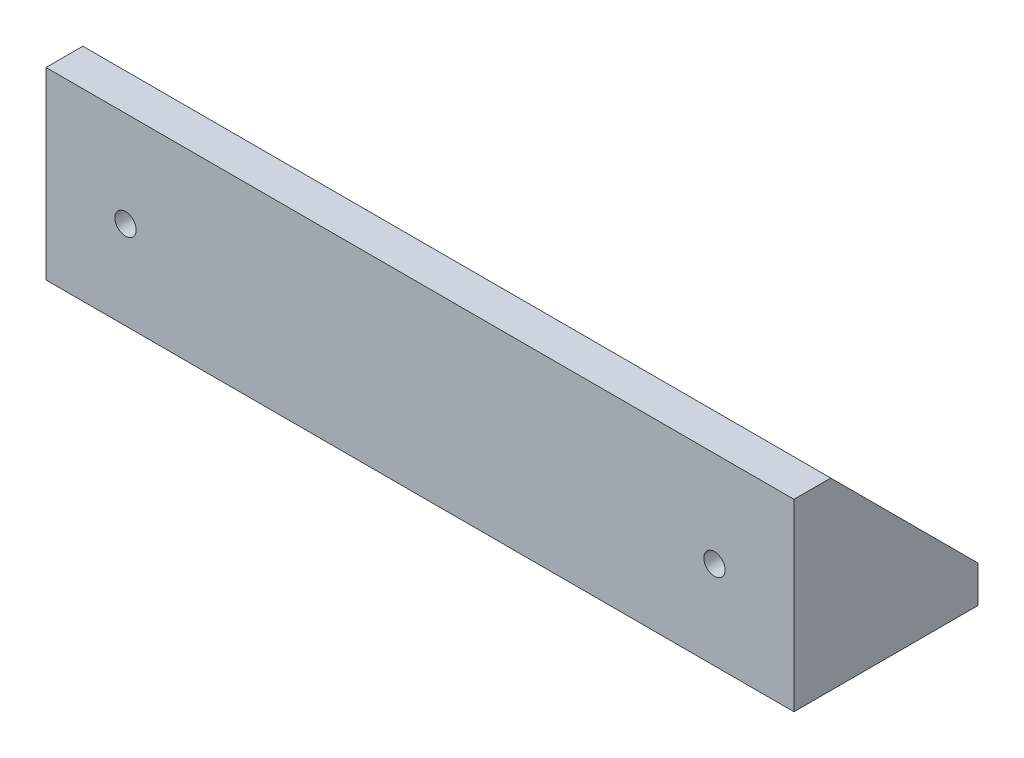
ISO-10303-21;
HEADER;
FILE_DESCRIPTION(('STEP AP214'),'2;1');
FILE_NAME('part.step','',(''),(''),'','','');
FILE_SCHEMA(('AUTOMOTIVE_DESIGN { 1 0 10303 214 1 1 1 1 }'));
ENDSEC;
DATA;
#1=APPLICATION_CONTEXT('core data for automotive mechanical design processes');
#2=APPLICATION_PROTOCOL_DEFINITION('international standard','automotive_design',2000,#1);
#3=PRODUCT_CONTEXT('',#1,'mechanical');
#4=PRODUCT('Part','Part','',(#3));
#5=PRODUCT_RELATED_PRODUCT_CATEGORY('part','',(#4));
#6=PRODUCT_DEFINITION_FORMATION('','',#4);
#7=PRODUCT_DEFINITION_CONTEXT('part definition',#1,'design');
#8=PRODUCT_DEFINITION('design','',#6,#7);
#9=PRODUCT_DEFINITION_SHAPE('','',#8);
#10=(LENGTH_UNIT() NAMED_UNIT(*) SI_UNIT(.MILLI.,.METRE.));
#11=(NAMED_UNIT(*) PLANE_ANGLE_UNIT() SI_UNIT($,.RADIAN.));
#12=(NAMED_UNIT(*) SI_UNIT($,.STERADIAN.) SOLID_ANGLE_UNIT());
#13=UNCERTAINTY_MEASURE_WITH_UNIT(LENGTH_MEASURE(1.E-05),#10,'distance_accuracy_value','');
#14=(GEOMETRIC_REPRESENTATION_CONTEXT(3) GLOBAL_UNCERTAINTY_ASSIGNED_CONTEXT((#13)) GLOBAL_UNIT_ASSIGNED_CONTEXT((#10,
#11,#12)) REPRESENTATION_CONTEXT('',''));
#15=CARTESIAN_POINT('',(0.,0.,0.));
#16=DIRECTION('',(0.,0.,1.));
#17=DIRECTION('',(1.,0.,0.));
#18=AXIS2_PLACEMENT_3D('',#15,#16,#17);
#19=CARTESIAN_POINT('',(50.8,5.,-25.));
#20=DIRECTION('',(0.,-0.707106781186548,0.707106781186548));
#21=DIRECTION('',(0.,-0.707106781186548,-0.707106781186548));
#22=AXIS2_PLACEMENT_3D('',#19,#20,#21);
#23=PLANE('',#22);
#24=DIRECTION('',(0.,0.707106781186548,0.707106781186548));
#25=VECTOR('',#24,1.);
#26=CARTESIAN_POINT('',(-45.,5.,-25.));
#27=LINE('',#26,#25);
#28=CARTESIAN_POINT('',(-45.,5.,-25.));
#29=VERTEX_POINT('',#28);
#30=CARTESIAN_POINT('',(-45.,25.,-5.));
#31=VERTEX_POINT('',#30);
#32=EDGE_CURVE('E11',#29,#31,#27,.T.);
#33=ORIENTED_EDGE('',*,*,#32,.F.);
#34=DIRECTION('',(-1.,0.,0.));
#35=VECTOR('',#34,1.);
#36=CARTESIAN_POINT('',(50.8,5.,-25.));
#37=LINE('',#36,#35);
#38=CARTESIAN_POINT('',(-50.8,5.,-25.));
#39=VERTEX_POINT('',#38);
#40=EDGE_CURVE('E159',#29,#39,#37,.T.);
#41=ORIENTED_EDGE('',*,*,#40,.T.);
#42=DIRECTION('',(0.,0.707106781186548,0.707106781186548));
#43=VECTOR('',#42,1.);
#44=CARTESIAN_POINT('',(-50.8,5.,-25.));
#45=LINE('',#44,#43);
#46=CARTESIAN_POINT('',(-50.8,25.,-5.));
#47=VERTEX_POINT('',#46);
#48=EDGE_CURVE('E151',#39,#47,#45,.T.);
#49=ORIENTED_EDGE('',*,*,#48,.T.);
#50=DIRECTION('',(-1.,0.,0.));
#51=VECTOR('',#50,1.);
#52=CARTESIAN_POINT('',(50.8,25.,-5.));
#53=LINE('',#52,#51);
#54=EDGE_CURVE('E92',#31,#47,#53,.T.);
#55=ORIENTED_EDGE('',*,*,#54,.F.);
#56=EDGE_LOOP('',(#33,#41,#49,#55));
#57=FACE_BOUND('',#56,.T.);
#58=ADVANCED_FACE('F41',(#57),#23,.F.);
#59=CARTESIAN_POINT('',(50.8,25.,-5.));
#60=DIRECTION('',(0.,-1.,0.));
#61=DIRECTION('',(0.,0.,-1.));
#62=AXIS2_PLACEMENT_3D('',#59,#60,#61);
#63=PLANE('',#62);
#64=DIRECTION('',(0.,0.,1.));
#65=VECTOR('',#64,1.);
#66=CARTESIAN_POINT('',(-50.8,25.,-5.));
#67=LINE('',#66,#65);
#68=CARTESIAN_POINT('',(-50.8,25.,0.));
#69=VERTEX_POINT('',#68);
#70=EDGE_CURVE('E139',#47,#69,#67,.T.);
#71=ORIENTED_EDGE('',*,*,#70,.T.);
#72=DIRECTION('',(-1.,0.,0.));
#73=VECTOR('',#72,1.);
#74=CARTESIAN_POINT('',(50.8,25.,0.));
#75=LINE('',#74,#73);
#76=CARTESIAN_POINT('',(50.8,25.,0.));
#77=VERTEX_POINT('',#76);
#78=EDGE_CURVE('E164',#77,#69,#75,.T.);
#79=ORIENTED_EDGE('',*,*,#78,.F.);
#80=DIRECTION('',(0.,0.,1.));
#81=VECTOR('',#80,1.);
#82=CARTESIAN_POINT('',(50.8,25.,-5.));
#83=LINE('',#82,#81);
#84=CARTESIAN_POINT('',(50.8,25.,-5.));
#85=VERTEX_POINT('',#84);
#86=EDGE_CURVE('E154',#85,#77,#83,.T.);
#87=ORIENTED_EDGE('',*,*,#86,.F.);
#88=CARTESIAN_POINT('',(45.,25.,-5.));
#89=VERTEX_POINT('',#88);
#90=EDGE_CURVE('E155',#85,#89,#53,.T.);
#91=ORIENTED_EDGE('',*,*,#90,.T.);
#92=DIRECTION('',(1.,0.,0.));
#93=VECTOR('',#92,1.);
#94=CARTESIAN_POINT('',(-45.,25.,-5.));
#95=LINE('',#94,#93);
#96=EDGE_CURVE('E143',#31,#89,#95,.T.);
#97=ORIENTED_EDGE('',*,*,#96,.F.);
#98=ORIENTED_EDGE('',*,*,#54,.T.);
#99=EDGE_LOOP('',(#71,#79,#87,#91,#97,#98));
#100=FACE_BOUND('',#99,.T.);
#101=ADVANCED_FACE('F43',(#100),#63,.F.);
#102=CARTESIAN_POINT('',(50.8,25.,0.));
#103=DIRECTION('',(0.,0.,-1.));
#104=DIRECTION('',(0.,1.,0.));
#105=AXIS2_PLACEMENT_3D('',#102,#103,#104);
#106=PLANE('',#105);
#107=CARTESIAN_POINT('',(-40.,12.,0.));
#108=DIRECTION('',(0.,0.,1.));
#109=DIRECTION('',(1.,0.,0.));
#110=AXIS2_PLACEMENT_3D('',#107,#108,#109);
#111=CIRCLE('',#110,1.44999999999999);
#112=CARTESIAN_POINT('',(-38.55,12.,0.));
#113=VERTEX_POINT('',#112);
#114=EDGE_CURVE('E224',#113,#113,#111,.T.);
#115=ORIENTED_EDGE('',*,*,#114,.F.);
#116=EDGE_LOOP('',(#115));
#117=FACE_BOUND('',#116,.T.);
#118=CARTESIAN_POINT('',(40.,12.,0.));
#119=DIRECTION('',(0.,0.,1.));
#120=DIRECTION('',(1.,0.,0.));
#121=AXIS2_PLACEMENT_3D('',#118,#119,#120);
#122=CIRCLE('',#121,1.44999999999999);
#123=CARTESIAN_POINT('',(41.45,12.,0.));
#124=VERTEX_POINT('',#123);
#125=EDGE_CURVE('E220',#124,#124,#122,.T.);
#126=ORIENTED_EDGE('',*,*,#125,.F.);
#127=EDGE_LOOP('',(#126));
#128=FACE_BOUND('',#127,.T.);
#129=DIRECTION('',(0.,-1.,0.));
#130=VECTOR('',#129,1.);
#131=CARTESIAN_POINT('',(-50.8,25.,0.));
#132=LINE('',#131,#130);
#133=CARTESIAN_POINT('',(-50.8,0.,0.));
#134=VERTEX_POINT('',#133);
#135=EDGE_CURVE('E142',#69,#134,#132,.T.);
#136=ORIENTED_EDGE('',*,*,#135,.T.);
#137=DIRECTION('',(-1.,0.,0.));
#138=VECTOR('',#137,1.);
#139=CARTESIAN_POINT('',(50.8,0.,0.));
#140=LINE('',#139,#138);
#141=CARTESIAN_POINT('',(50.8,0.,0.));
#142=VERTEX_POINT('',#141);
#143=EDGE_CURVE('E127',#142,#134,#140,.T.);
#144=ORIENTED_EDGE('',*,*,#143,.F.);
#145=DIRECTION('',(0.,-1.,0.));
#146=VECTOR('',#145,1.);
#147=CARTESIAN_POINT('',(50.8,25.,0.));
#148=LINE('',#147,#146);
#149=EDGE_CURVE('E101',#77,#142,#148,.T.);
#150=ORIENTED_EDGE('',*,*,#149,.F.);
#151=ORIENTED_EDGE('',*,*,#78,.T.);
#152=EDGE_LOOP('',(#136,#144,#150,#151));
#153=FACE_BOUND('',#152,.T.);
#154=ADVANCED_FACE('F252',(#117,#128,#153),#106,.F.);
#155=CARTESIAN_POINT('',(50.8,0.,0.));
#156=DIRECTION('',(0.,1.,0.));
#157=DIRECTION('',(0.,0.,1.));
#158=AXIS2_PLACEMENT_3D('',#155,#156,#157);
#159=PLANE('',#158);
#160=CARTESIAN_POINT('',(-40.,0.,-12.));
#161=DIRECTION('',(0.,-1.,0.));
#162=DIRECTION('',(0.,0.,-1.));
#163=AXIS2_PLACEMENT_3D('',#160,#161,#162);
#164=CIRCLE('',#163,1.44999999999999);
#165=CARTESIAN_POINT('',(-40.,0.,-13.45));
#166=VERTEX_POINT('',#165);
#167=EDGE_CURVE('E212',#166,#166,#164,.T.);
#168=ORIENTED_EDGE('',*,*,#167,.F.);
#169=EDGE_LOOP('',(#168));
#170=FACE_BOUND('',#169,.T.);
#171=CARTESIAN_POINT('',(40.,0.,-12.));
#172=DIRECTION('',(0.,-1.,0.));
#173=DIRECTION('',(0.,0.,-1.));
#174=AXIS2_PLACEMENT_3D('',#171,#172,#173);
#175=CIRCLE('',#174,1.44999999999999);
#176=CARTESIAN_POINT('',(40.,0.,-13.45));
#177=VERTEX_POINT('',#176);
#178=EDGE_CURVE('E204',#177,#177,#175,.T.);
#179=ORIENTED_EDGE('',*,*,#178,.F.);
#180=EDGE_LOOP('',(#179));
#181=FACE_BOUND('',#180,.T.);
#182=DIRECTION('',(0.,0.,-1.));
#183=VECTOR('',#182,1.);
#184=CARTESIAN_POINT('',(-50.8,0.,0.));
#185=LINE('',#184,#183);
#186=CARTESIAN_POINT('',(-50.8,0.,-25.));
#187=VERTEX_POINT('',#186);
#188=EDGE_CURVE('E122',#134,#187,#185,.T.);
#189=ORIENTED_EDGE('',*,*,#188,.T.);
#190=DIRECTION('',(-1.,0.,0.));
#191=VECTOR('',#190,1.);
#192=CARTESIAN_POINT('',(50.8,0.,-25.));
#193=LINE('',#192,#191);
#194=CARTESIAN_POINT('',(50.8,0.,-25.));
#195=VERTEX_POINT('',#194);
#196=EDGE_CURVE('E119',#195,#187,#193,.T.);
#197=ORIENTED_EDGE('',*,*,#196,.F.);
#198=DIRECTION('',(0.,0.,-1.));
#199=VECTOR('',#198,1.);
#200=CARTESIAN_POINT('',(50.8,0.,0.));
#201=LINE('',#200,#199);
#202=EDGE_CURVE('E108',#142,#195,#201,.T.);
#203=ORIENTED_EDGE('',*,*,#202,.F.);
#204=ORIENTED_EDGE('',*,*,#143,.T.);
#205=EDGE_LOOP('',(#189,#197,#203,#204));
#206=FACE_BOUND('',#205,.T.);
#207=ADVANCED_FACE('F120',(#170,#181,#206),#159,.F.);
#208=CARTESIAN_POINT('',(50.8,0.,-25.));
#209=DIRECTION('',(0.,0.,1.));
#210=DIRECTION('',(1.,0.,0.));
#211=AXIS2_PLACEMENT_3D('',#208,#209,#210);
#212=PLANE('',#211);
#213=DIRECTION('',(0.,1.,0.));
#214=VECTOR('',#213,1.);
#215=CARTESIAN_POINT('',(-50.8,0.,-25.));
#216=LINE('',#215,#214);
#217=EDGE_CURVE('E148',#187,#39,#216,.T.);
#218=ORIENTED_EDGE('',*,*,#217,.T.);
#219=ORIENTED_EDGE('',*,*,#40,.F.);
#220=DIRECTION('',(1.,0.,0.));
#221=VECTOR('',#220,1.);
#222=CARTESIAN_POINT('',(-45.,5.,-25.));
#223=LINE('',#222,#221);
#224=CARTESIAN_POINT('',(45.,5.,-25.));
#225=VERTEX_POINT('',#224);
#226=EDGE_CURVE('E182',#29,#225,#223,.T.);
#227=ORIENTED_EDGE('',*,*,#226,.T.);
#228=CARTESIAN_POINT('',(50.8,5.,-25.));
#229=VERTEX_POINT('',#228);
#230=EDGE_CURVE('E128',#229,#225,#37,.T.);
#231=ORIENTED_EDGE('',*,*,#230,.F.);
#232=DIRECTION('',(0.,1.,0.));
#233=VECTOR('',#232,1.);
#234=CARTESIAN_POINT('',(50.8,0.,-25.));
#235=LINE('',#234,#233);
#236=EDGE_CURVE('E112',#195,#229,#235,.T.);
#237=ORIENTED_EDGE('',*,*,#236,.F.);
#238=ORIENTED_EDGE('',*,*,#196,.T.);
#239=EDGE_LOOP('',(#218,#219,#227,#231,#237,#238));
#240=FACE_BOUND('',#239,.T.);
#241=ADVANCED_FACE('F130',(#240),#212,.F.);
#242=ORIENTED_EDGE('',*,*,#230,.T.);
#243=DIRECTION('',(0.,0.707106781186548,0.707106781186548));
#244=VECTOR('',#243,1.);
#245=CARTESIAN_POINT('',(45.,5.,-25.));
#246=LINE('',#245,#244);
#247=EDGE_CURVE('E51',#225,#89,#246,.T.);
#248=ORIENTED_EDGE('',*,*,#247,.T.);
#249=ORIENTED_EDGE('',*,*,#90,.F.);
#250=DIRECTION('',(0.,0.707106781186548,0.707106781186548));
#251=VECTOR('',#250,1.);
#252=CARTESIAN_POINT('',(50.8,5.,-25.));
#253=LINE('',#252,#251);
#254=EDGE_CURVE('E67',#229,#85,#253,.T.);
#255=ORIENTED_EDGE('',*,*,#254,.F.);
#256=EDGE_LOOP('',(#242,#248,#249,#255));
#257=FACE_BOUND('',#256,.T.);
#258=ADVANCED_FACE('F170',(#257),#23,.F.);
#259=CARTESIAN_POINT('',(50.8,0.,0.));
#260=DIRECTION('',(1.,0.,0.));
#261=DIRECTION('',(0.,0.,-1.));
#262=AXIS2_PLACEMENT_3D('',#259,#260,#261);
#263=PLANE('',#262);
#264=ORIENTED_EDGE('',*,*,#86,.T.);
#265=ORIENTED_EDGE('',*,*,#149,.T.);
#266=ORIENTED_EDGE('',*,*,#202,.T.);
#267=ORIENTED_EDGE('',*,*,#236,.T.);
#268=ORIENTED_EDGE('',*,*,#254,.T.);
#269=EDGE_LOOP('',(#264,#265,#266,#267,#268));
#270=FACE_BOUND('',#269,.T.);
#271=ADVANCED_FACE('F110',(#270),#263,.T.);
#272=CARTESIAN_POINT('',(-50.8,0.,0.));
#273=DIRECTION('',(1.,0.,0.));
#274=DIRECTION('',(0.,0.,-1.));
#275=AXIS2_PLACEMENT_3D('',#272,#273,#274);
#276=PLANE('',#275);
#277=ORIENTED_EDGE('',*,*,#70,.F.);
#278=ORIENTED_EDGE('',*,*,#48,.F.);
#279=ORIENTED_EDGE('',*,*,#217,.F.);
#280=ORIENTED_EDGE('',*,*,#188,.F.);
#281=ORIENTED_EDGE('',*,*,#135,.F.);
#282=EDGE_LOOP('',(#277,#278,#279,#280,#281));
#283=FACE_BOUND('',#282,.T.);
#284=ADVANCED_FACE('F261',(#283),#276,.F.);
#285=CARTESIAN_POINT('',(-45.,0.,0.));
#286=DIRECTION('',(1.,0.,0.));
#287=DIRECTION('',(0.,0.,-1.));
#288=AXIS2_PLACEMENT_3D('',#285,#286,#287);
#289=PLANE('',#288);
#290=ORIENTED_EDGE('',*,*,#32,.T.);
#291=DIRECTION('',(0.,-1.,0.));
#292=VECTOR('',#291,1.);
#293=CARTESIAN_POINT('',(-45.,25.,-5.));
#294=LINE('',#293,#292);
#295=CARTESIAN_POINT('',(-45.,5.,-5.));
#296=VERTEX_POINT('',#295);
#297=EDGE_CURVE('E191',#31,#296,#294,.T.);
#298=ORIENTED_EDGE('',*,*,#297,.T.);
#299=DIRECTION('',(0.,0.,-1.));
#300=VECTOR('',#299,1.);
#301=CARTESIAN_POINT('',(-45.,5.,-5.));
#302=LINE('',#301,#300);
#303=EDGE_CURVE('E183',#296,#29,#302,.T.);
#304=ORIENTED_EDGE('',*,*,#303,.T.);
#305=EDGE_LOOP('',(#290,#298,#304));
#306=FACE_BOUND('',#305,.T.);
#307=ADVANCED_FACE('F286',(#306),#289,.T.);
#308=CARTESIAN_POINT('',(45.,0.,0.));
#309=DIRECTION('',(1.,0.,0.));
#310=DIRECTION('',(0.,0.,-1.));
#311=AXIS2_PLACEMENT_3D('',#308,#309,#310);
#312=PLANE('',#311);
#313=DIRECTION('',(0.,0.,-1.));
#314=VECTOR('',#313,1.);
#315=CARTESIAN_POINT('',(45.,5.,-5.));
#316=LINE('',#315,#314);
#317=CARTESIAN_POINT('',(45.,5.,-5.));
#318=VERTEX_POINT('',#317);
#319=EDGE_CURVE('E188',#318,#225,#316,.T.);
#320=ORIENTED_EDGE('',*,*,#319,.F.);
#321=DIRECTION('',(0.,-1.,0.));
#322=VECTOR('',#321,1.);
#323=CARTESIAN_POINT('',(45.,25.,-5.));
#324=LINE('',#323,#322);
#325=EDGE_CURVE('E58',#89,#318,#324,.T.);
#326=ORIENTED_EDGE('',*,*,#325,.F.);
#327=ORIENTED_EDGE('',*,*,#247,.F.);
#328=EDGE_LOOP('',(#320,#326,#327));
#329=FACE_BOUND('',#328,.T.);
#330=ADVANCED_FACE('F295',(#329),#312,.F.);
#331=CARTESIAN_POINT('',(-45.,25.,-5.));
#332=DIRECTION('',(0.,0.,1.));
#333=DIRECTION('',(0.,-1.,0.));
#334=AXIS2_PLACEMENT_3D('',#331,#332,#333);
#335=PLANE('',#334);
#336=CARTESIAN_POINT('',(-40.,12.,-5.));
#337=DIRECTION('',(0.,0.,1.));
#338=DIRECTION('',(0.,-1.,0.));
#339=AXIS2_PLACEMENT_3D('',#336,#337,#338);
#340=CIRCLE('',#339,1.44999999999999);
#341=CARTESIAN_POINT('',(-40.,10.55,-5.));
#342=VERTEX_POINT('',#341);
#343=EDGE_CURVE('E45',#342,#342,#340,.T.);
#344=ORIENTED_EDGE('',*,*,#343,.T.);
#345=EDGE_LOOP('',(#344));
#346=FACE_BOUND('',#345,.T.);
#347=CARTESIAN_POINT('',(40.,12.,-5.));
#348=DIRECTION('',(0.,0.,1.));
#349=DIRECTION('',(0.,-1.,0.));
#350=AXIS2_PLACEMENT_3D('',#347,#348,#349);
#351=CIRCLE('',#350,1.44999999999999);
#352=CARTESIAN_POINT('',(40.,10.55,-5.));
#353=VERTEX_POINT('',#352);
#354=EDGE_CURVE('E216',#353,#353,#351,.T.);
#355=ORIENTED_EDGE('',*,*,#354,.T.);
#356=EDGE_LOOP('',(#355));
#357=FACE_BOUND('',#356,.T.);
#358=ORIENTED_EDGE('',*,*,#325,.T.);
#359=DIRECTION('',(1.,0.,0.));
#360=VECTOR('',#359,1.);
#361=CARTESIAN_POINT('',(-45.,5.,-5.));
#362=LINE('',#361,#360);
#363=EDGE_CURVE('E178',#296,#318,#362,.T.);
#364=ORIENTED_EDGE('',*,*,#363,.F.);
#365=ORIENTED_EDGE('',*,*,#297,.F.);
#366=ORIENTED_EDGE('',*,*,#96,.T.);
#367=EDGE_LOOP('',(#358,#364,#365,#366));
#368=FACE_BOUND('',#367,.T.);
#369=ADVANCED_FACE('F233',(#346,#357,#368),#335,.F.);
#370=CARTESIAN_POINT('',(-45.,5.,-5.));
#371=DIRECTION('',(0.,-1.,0.));
#372=DIRECTION('',(0.,0.,-1.));
#373=AXIS2_PLACEMENT_3D('',#370,#371,#372);
#374=PLANE('',#373);
#375=CARTESIAN_POINT('',(-40.,5.,-12.));
#376=DIRECTION('',(0.,-1.,0.));
#377=DIRECTION('',(0.,0.,-1.));
#378=AXIS2_PLACEMENT_3D('',#375,#376,#377);
#379=CIRCLE('',#378,1.44999999999999);
#380=CARTESIAN_POINT('',(-40.,5.,-13.45));
#381=VERTEX_POINT('',#380);
#382=EDGE_CURVE('E208',#381,#381,#379,.T.);
#383=ORIENTED_EDGE('',*,*,#382,.T.);
#384=EDGE_LOOP('',(#383));
#385=FACE_BOUND('',#384,.T.);
#386=CARTESIAN_POINT('',(40.,5.,-12.));
#387=DIRECTION('',(0.,-1.,0.));
#388=DIRECTION('',(0.,0.,-1.));
#389=AXIS2_PLACEMENT_3D('',#386,#387,#388);
#390=CIRCLE('',#389,1.44999999999999);
#391=CARTESIAN_POINT('',(40.,5.,-13.45));
#392=VERTEX_POINT('',#391);
#393=EDGE_CURVE('E194',#392,#392,#390,.T.);
#394=ORIENTED_EDGE('',*,*,#393,.T.);
#395=EDGE_LOOP('',(#394));
#396=FACE_BOUND('',#395,.T.);
#397=ORIENTED_EDGE('',*,*,#319,.T.);
#398=ORIENTED_EDGE('',*,*,#226,.F.);
#399=ORIENTED_EDGE('',*,*,#303,.F.);
#400=ORIENTED_EDGE('',*,*,#363,.T.);
#401=EDGE_LOOP('',(#397,#398,#399,#400));
#402=FACE_BOUND('',#401,.T.);
#403=ADVANCED_FACE('F294',(#385,#396,#402),#374,.F.);
#404=CARTESIAN_POINT('',(40.,0.,-12.));
#405=DIRECTION('',(0.,-1.,0.));
#406=DIRECTION('',(0.,0.,-1.));
#407=AXIS2_PLACEMENT_3D('',#404,#405,#406);
#408=CYLINDRICAL_SURFACE('',#407,1.44999999999999);
#409=ORIENTED_EDGE('',*,*,#178,.T.);
#410=EDGE_LOOP('',(#409));
#411=FACE_BOUND('',#410,.T.);
#412=ORIENTED_EDGE('',*,*,#393,.F.);
#413=EDGE_LOOP('',(#412));
#414=FACE_BOUND('',#413,.T.);
#415=ADVANCED_FACE('F307',(#411,#414),#408,.F.);
#416=CARTESIAN_POINT('',(-40.,0.,-12.));
#417=DIRECTION('',(0.,-1.,0.));
#418=DIRECTION('',(0.,0.,-1.));
#419=AXIS2_PLACEMENT_3D('',#416,#417,#418);
#420=CYLINDRICAL_SURFACE('',#419,1.44999999999999);
#421=ORIENTED_EDGE('',*,*,#167,.T.);
#422=EDGE_LOOP('',(#421));
#423=FACE_BOUND('',#422,.T.);
#424=ORIENTED_EDGE('',*,*,#382,.F.);
#425=EDGE_LOOP('',(#424));
#426=FACE_BOUND('',#425,.T.);
#427=ADVANCED_FACE('F243',(#423,#426),#420,.F.);
#428=CARTESIAN_POINT('',(40.,12.,0.));
#429=DIRECTION('',(0.,0.,1.));
#430=DIRECTION('',(1.,0.,0.));
#431=AXIS2_PLACEMENT_3D('',#428,#429,#430);
#432=CYLINDRICAL_SURFACE('',#431,1.44999999999999);
#433=ORIENTED_EDGE('',*,*,#125,.T.);
#434=EDGE_LOOP('',(#433));
#435=FACE_BOUND('',#434,.T.);
#436=ORIENTED_EDGE('',*,*,#354,.F.);
#437=EDGE_LOOP('',(#436));
#438=FACE_BOUND('',#437,.T.);
#439=ADVANCED_FACE('F238',(#435,#438),#432,.F.);
#440=CARTESIAN_POINT('',(-40.,12.,0.));
#441=DIRECTION('',(0.,0.,1.));
#442=DIRECTION('',(1.,0.,0.));
#443=AXIS2_PLACEMENT_3D('',#440,#441,#442);
#444=CYLINDRICAL_SURFACE('',#443,1.44999999999999);
#445=ORIENTED_EDGE('',*,*,#114,.T.);
#446=EDGE_LOOP('',(#445));
#447=FACE_BOUND('',#446,.T.);
#448=ORIENTED_EDGE('',*,*,#343,.F.);
#449=EDGE_LOOP('',(#448));
#450=FACE_BOUND('',#449,.T.);
#451=ADVANCED_FACE('F236',(#447,#450),#444,.F.);
#452=CLOSED_SHELL('',(#58,#101,#154,#207,#241,#258,#271,#284,#307,#330,#369,#403,#415,#427,#439,#451));
#453=MANIFOLD_SOLID_BREP('B2',#452);
#454=ADVANCED_BREP_SHAPE_REPRESENTATION('',(#18,#453),#14);
#455=SHAPE_DEFINITION_REPRESENTATION(#9,#454);
ENDSEC;
END-ISO-10303-21;
